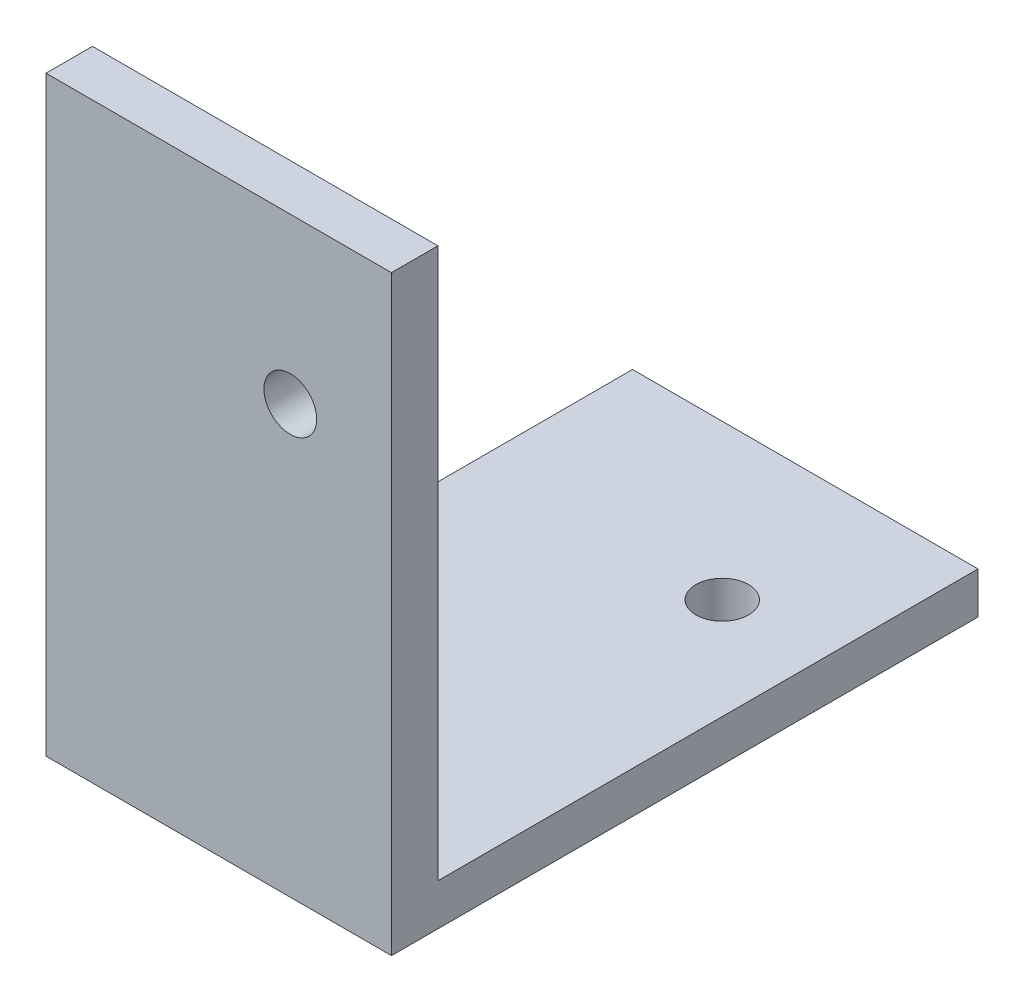
ISO-10303-21;
HEADER;
FILE_DESCRIPTION(('STEP AP214'),'2;1');
FILE_NAME('part.step','',(''),(''),'','','');
FILE_SCHEMA(('AUTOMOTIVE_DESIGN { 1 0 10303 214 1 1 1 1 }'));
ENDSEC;
DATA;
#1=APPLICATION_CONTEXT('core data for automotive mechanical design processes');
#2=APPLICATION_PROTOCOL_DEFINITION('international standard','automotive_design',2000,#1);
#3=PRODUCT_CONTEXT('',#1,'mechanical');
#4=PRODUCT('Part','Part','',(#3));
#5=PRODUCT_RELATED_PRODUCT_CATEGORY('part','',(#4));
#6=PRODUCT_DEFINITION_FORMATION('','',#4);
#7=PRODUCT_DEFINITION_CONTEXT('part definition',#1,'design');
#8=PRODUCT_DEFINITION('design','',#6,#7);
#9=PRODUCT_DEFINITION_SHAPE('','',#8);
#10=(LENGTH_UNIT() NAMED_UNIT(*) SI_UNIT(.MILLI.,.METRE.));
#11=(NAMED_UNIT(*) PLANE_ANGLE_UNIT() SI_UNIT($,.RADIAN.));
#12=(NAMED_UNIT(*) SI_UNIT($,.STERADIAN.) SOLID_ANGLE_UNIT());
#13=UNCERTAINTY_MEASURE_WITH_UNIT(LENGTH_MEASURE(1.E-05),#10,'distance_accuracy_value','');
#14=(GEOMETRIC_REPRESENTATION_CONTEXT(3) GLOBAL_UNCERTAINTY_ASSIGNED_CONTEXT((#13)) GLOBAL_UNIT_ASSIGNED_CONTEXT((#10,
#11,#12)) REPRESENTATION_CONTEXT('',''));
#15=CARTESIAN_POINT('',(0.,0.,0.));
#16=DIRECTION('',(0.,0.,1.));
#17=DIRECTION('',(1.,0.,0.));
#18=AXIS2_PLACEMENT_3D('',#15,#16,#17);
#19=CARTESIAN_POINT('',(19.142135623731,-40.,-19.142135623731));
#20=DIRECTION('',(0.,1.,0.));
#21=DIRECTION('',(0.,0.,1.));
#22=AXIS2_PLACEMENT_3D('',#19,#20,#21);
#23=CYLINDRICAL_SURFACE('',#22,1.525);
#24=CARTESIAN_POINT('',(19.142135623731,-5.58625904914895,-19.142135623731));
#25=DIRECTION('',(0.,1.,0.));
#26=DIRECTION('',(0.,0.,1.));
#27=AXIS2_PLACEMENT_3D('',#24,#25,#26);
#28=CIRCLE('',#27,1.525);
#29=CARTESIAN_POINT('',(19.142135623731,-5.58625904914894,-17.6171356237309));
#30=VERTEX_POINT('',#29);
#31=EDGE_CURVE('E147',#30,#30,#28,.F.);
#32=CARTESIAN_POINT('',(19.142135623731,-3.17499999999997,-19.142135623731));
#33=DIRECTION('',(0.,1.,0.));
#34=DIRECTION('',(0.,0.,1.));
#35=AXIS2_PLACEMENT_3D('',#32,#33,#34);
#36=CIRCLE('',#35,1.525);
#37=CARTESIAN_POINT('',(19.142135623731,-3.17499999999997,-17.6171356237309));
#38=VERTEX_POINT('',#37);
#39=EDGE_CURVE('E132',#38,#38,#36,.F.);
#40=CARTESIAN_POINT('',(19.142135623731,-5.58625904914894,-17.6171356237309));
#41=CARTESIAN_POINT('',(19.142135623731,-5.56114176738698,-17.6171356237309));
#42=CARTESIAN_POINT('',(19.142135623731,-5.53602448562501,-17.6171356237309));
#43=CARTESIAN_POINT('',(19.142135623731,-5.48578992210107,-17.6171356237309));
#44=CARTESIAN_POINT('',(19.142135623731,-5.4606726403391,-17.6171356237309));
#45=CARTESIAN_POINT('',(19.142135623731,-5.41043807681517,-17.6171356237309));
#46=CARTESIAN_POINT('',(19.142135623731,-5.3853207950532,-17.6171356237309));
#47=CARTESIAN_POINT('',(19.142135623731,-5.33508623152926,-17.6171356237309));
#48=CARTESIAN_POINT('',(19.142135623731,-5.30996894976729,-17.6171356237309));
#49=CARTESIAN_POINT('',(19.142135623731,-5.25973438624336,-17.6171356237309));
#50=CARTESIAN_POINT('',(19.142135623731,-5.23461710448139,-17.6171356237309));
#51=CARTESIAN_POINT('',(19.142135623731,-5.18438254095745,-17.6171356237309));
#52=CARTESIAN_POINT('',(19.142135623731,-5.15926525919548,-17.6171356237309));
#53=CARTESIAN_POINT('',(19.142135623731,-5.10903069567155,-17.6171356237309));
#54=CARTESIAN_POINT('',(19.142135623731,-5.08391341390958,-17.6171356237309));
#55=CARTESIAN_POINT('',(19.142135623731,-5.03367885038564,-17.6171356237309));
#56=CARTESIAN_POINT('',(19.142135623731,-5.00856156862367,-17.6171356237309));
#57=CARTESIAN_POINT('',(19.142135623731,-4.95832700509973,-17.6171356237309));
#58=CARTESIAN_POINT('',(19.142135623731,-4.93320972333776,-17.6171356237309));
#59=CARTESIAN_POINT('',(19.142135623731,-4.88297515981382,-17.6171356237309));
#60=CARTESIAN_POINT('',(19.142135623731,-4.85785787805186,-17.6171356237309));
#61=CARTESIAN_POINT('',(19.142135623731,-4.80762331452792,-17.6171356237309));
#62=CARTESIAN_POINT('',(19.142135623731,-4.78250603276595,-17.6171356237309));
#63=CARTESIAN_POINT('',(19.142135623731,-4.73227146924201,-17.6171356237309));
#64=CARTESIAN_POINT('',(19.142135623731,-4.70715418748005,-17.6171356237309));
#65=CARTESIAN_POINT('',(19.142135623731,-4.65691962395611,-17.6171356237309));
#66=CARTESIAN_POINT('',(19.142135623731,-4.63180234219414,-17.6171356237309));
#67=CARTESIAN_POINT('',(19.142135623731,-4.5815677786702,-17.6171356237309));
#68=CARTESIAN_POINT('',(19.142135623731,-4.55645049690824,-17.6171356237309));
#69=CARTESIAN_POINT('',(19.142135623731,-4.5062159333843,-17.6171356237309));
#70=CARTESIAN_POINT('',(19.142135623731,-4.48109865162233,-17.6171356237309));
#71=CARTESIAN_POINT('',(19.142135623731,-4.43086408809839,-17.6171356237309));
#72=CARTESIAN_POINT('',(19.142135623731,-4.40574680633643,-17.6171356237309));
#73=CARTESIAN_POINT('',(19.142135623731,-4.35551224281249,-17.6171356237309));
#74=CARTESIAN_POINT('',(19.142135623731,-4.33039496105052,-17.6171356237309));
#75=CARTESIAN_POINT('',(19.142135623731,-4.28016039752658,-17.6171356237309));
#76=CARTESIAN_POINT('',(19.142135623731,-4.25504311576462,-17.6171356237309));
#77=CARTESIAN_POINT('',(19.142135623731,-4.20480855224068,-17.6171356237309));
#78=CARTESIAN_POINT('',(19.142135623731,-4.17969127047871,-17.6171356237309));
#79=CARTESIAN_POINT('',(19.142135623731,-4.12945670695477,-17.6171356237309));
#80=CARTESIAN_POINT('',(19.142135623731,-4.10433942519281,-17.6171356237309));
#81=CARTESIAN_POINT('',(19.142135623731,-4.05410486166887,-17.6171356237309));
#82=CARTESIAN_POINT('',(19.142135623731,-4.0289875799069,-17.6171356237309));
#83=CARTESIAN_POINT('',(19.142135623731,-3.97875301638296,-17.6171356237309));
#84=CARTESIAN_POINT('',(19.142135623731,-3.953635734621,-17.6171356237309));
#85=CARTESIAN_POINT('',(19.142135623731,-3.90340117109706,-17.6171356237309));
#86=CARTESIAN_POINT('',(19.142135623731,-3.87828388933509,-17.6171356237309));
#87=CARTESIAN_POINT('',(19.142135623731,-3.82804932581115,-17.6171356237309));
#88=CARTESIAN_POINT('',(19.142135623731,-3.80293204404918,-17.6171356237309));
#89=CARTESIAN_POINT('',(19.142135623731,-3.75269748052524,-17.6171356237309));
#90=CARTESIAN_POINT('',(19.142135623731,-3.72758019876327,-17.6171356237309));
#91=CARTESIAN_POINT('',(19.142135623731,-3.67734563523934,-17.6171356237309));
#92=CARTESIAN_POINT('',(19.142135623731,-3.65222835347737,-17.6171356237309));
#93=CARTESIAN_POINT('',(19.142135623731,-3.60199378995343,-17.6171356237309));
#94=CARTESIAN_POINT('',(19.142135623731,-3.57687650819146,-17.6171356237309));
#95=CARTESIAN_POINT('',(19.142135623731,-3.52664194466753,-17.6171356237309));
#96=CARTESIAN_POINT('',(19.142135623731,-3.50152466290556,-17.6171356237309));
#97=CARTESIAN_POINT('',(19.142135623731,-3.45129009938162,-17.6171356237309));
#98=CARTESIAN_POINT('',(19.142135623731,-3.42617281761965,-17.6171356237309));
#99=CARTESIAN_POINT('',(19.142135623731,-3.37593825409572,-17.6171356237309));
#100=CARTESIAN_POINT('',(19.142135623731,-3.35082097233375,-17.6171356237309));
#101=CARTESIAN_POINT('',(19.142135623731,-3.30058640880981,-17.6171356237309));
#102=CARTESIAN_POINT('',(19.142135623731,-3.27546912704784,-17.6171356237309));
#103=CARTESIAN_POINT('',(19.142135623731,-3.22523456352391,-17.6171356237309));
#104=CARTESIAN_POINT('',(19.142135623731,-3.20011728176194,-17.6171356237309));
#105=CARTESIAN_POINT('',(19.142135623731,-3.17499999999997,-17.6171356237309));
#106=B_SPLINE_CURVE_WITH_KNOTS('',3,(#40,#41,#42,#43,#44,#45,#46,#47,#48,#49,#50,#51,#52,#53,
#54,#55,#56,#57,#58,#59,#60,#61,#62,#63,#64,#65,#66,#67,#68,#69,#70,#71,#72,#73,#74,#75,#76,#77,
#78,#79,#80,#81,#82,#83,#84,#85,#86,#87,#88,#89,#90,#91,#92,#93,#94,#95,#96,#97,#98,#99,#100,
#101,#102,#103,#104,#105),.UNSPECIFIED.,.F.,.F.,(4,2,2,2,2,2,2,2,2,2,2,2,2,2,2,2,2,2,2,2,2,2,2,
2,2,2,2,2,2,2,2,2,4),(0.,0.0753518452859051,0.15070369057181,0.226055535857715,0.30140738114362,
0.376759226429525,0.45211107171543,0.527462917001335,0.60281476228724,0.678166607573152,
0.753518452859057,0.828870298144962,0.904222143430867,0.979573988716773,1.05492583400268,
1.13027767928858,1.20562952457449,1.28098136986039,1.3563332151463,1.4316850604322,
1.50703690571811,1.58238875100401,1.65774059628992,1.73309244157582,1.80844428686173,
1.88379613214764,1.95914797743355,2.03449982271945,2.10985166800536,2.18520351329126,
2.26055535857717,2.33590720386307,2.41125904914898),.UNSPECIFIED.);
#107=EDGE_CURVE('BSEAM59',#30,#38,#106,.T.);
#108=ORIENTED_EDGE('',*,*,#31,.T.);
#109=ORIENTED_EDGE('',*,*,#39,.F.);
#110=ORIENTED_EDGE('',*,*,#107,.T.);
#111=ORIENTED_EDGE('',*,*,#107,.F.);
#112=EDGE_LOOP('',(#108,#110,#109,#111));
#113=FACE_BOUND('',#112,.T.);
#114=ADVANCED_FACE('F59',(#113),#23,.F.);
#115=CARTESIAN_POINT('',(19.142135623731,19.142135623731,40.));
#116=DIRECTION('',(0.,0.,-1.));
#117=DIRECTION('',(-1.,0.,0.));
#118=AXIS2_PLACEMENT_3D('',#115,#116,#117);
#119=CYLINDRICAL_SURFACE('',#118,1.525);
#120=CARTESIAN_POINT('',(19.142135623731,19.142135623731,5.86559661959344));
#121=DIRECTION('',(0.,0.,1.));
#122=DIRECTION('',(1.,0.,0.));
#123=AXIS2_PLACEMENT_3D('',#120,#121,#122);
#124=CIRCLE('',#123,1.525);
#125=CARTESIAN_POINT('',(17.617135623731,19.142135623731,5.86559661959343));
#126=VERTEX_POINT('',#125);
#127=EDGE_CURVE('E62',#126,#126,#124,.F.);
#128=CARTESIAN_POINT('',(19.142135623731,19.142135623731,3.175));
#129=DIRECTION('',(0.,0.,-1.));
#130=DIRECTION('',(-1.,0.,0.));
#131=AXIS2_PLACEMENT_3D('',#128,#129,#130);
#132=CIRCLE('',#131,1.525);
#133=CARTESIAN_POINT('',(17.617135623731,19.142135623731,3.175));
#134=VERTEX_POINT('',#133);
#135=EDGE_CURVE('E129',#134,#134,#132,.F.);
#136=CARTESIAN_POINT('',(17.617135623731,19.142135623731,5.86559661959343));
#137=CARTESIAN_POINT('',(17.617135623731,19.142135623731,5.83756957147267));
#138=CARTESIAN_POINT('',(17.617135623731,19.142135623731,5.8095425233519));
#139=CARTESIAN_POINT('',(17.617135623731,19.142135623731,5.75348842711037));
#140=CARTESIAN_POINT('',(17.617135623731,19.142135623731,5.72546137898961));
#141=CARTESIAN_POINT('',(17.617135623731,19.142135623731,5.66940728274808));
#142=CARTESIAN_POINT('',(17.617135623731,19.142135623731,5.64138023462731));
#143=CARTESIAN_POINT('',(17.617135623731,19.142135623731,5.58532613838578));
#144=CARTESIAN_POINT('',(17.617135623731,19.142135623731,5.55729909026502));
#145=CARTESIAN_POINT('',(17.617135623731,19.142135623731,5.50124499402349));
#146=CARTESIAN_POINT('',(17.617135623731,19.142135623731,5.47321794590272));
#147=CARTESIAN_POINT('',(17.617135623731,19.142135623731,5.41716384966119));
#148=CARTESIAN_POINT('',(17.617135623731,19.142135623731,5.38913680154043));
#149=CARTESIAN_POINT('',(17.617135623731,19.142135623731,5.3330827052989));
#150=CARTESIAN_POINT('',(17.617135623731,19.142135623731,5.30505565717813));
#151=CARTESIAN_POINT('',(17.617135623731,19.142135623731,5.24900156093661));
#152=CARTESIAN_POINT('',(17.617135623731,19.142135623731,5.22097451281584));
#153=CARTESIAN_POINT('',(17.617135623731,19.142135623731,5.16492041657431));
#154=CARTESIAN_POINT('',(17.617135623731,19.142135623731,5.13689336845354));
#155=CARTESIAN_POINT('',(17.617135623731,19.142135623731,5.08083927221201));
#156=CARTESIAN_POINT('',(17.617135623731,19.142135623731,5.05281222409125));
#157=CARTESIAN_POINT('',(17.617135623731,19.142135623731,4.99675812784972));
#158=CARTESIAN_POINT('',(17.617135623731,19.142135623731,4.96873107972896));
#159=CARTESIAN_POINT('',(17.617135623731,19.142135623731,4.91267698348743));
#160=CARTESIAN_POINT('',(17.617135623731,19.142135623731,4.88464993536666));
#161=CARTESIAN_POINT('',(17.617135623731,19.142135623731,4.82859583912513));
#162=CARTESIAN_POINT('',(17.617135623731,19.142135623731,4.80056879100436));
#163=CARTESIAN_POINT('',(17.617135623731,19.142135623731,4.74451469476284));
#164=CARTESIAN_POINT('',(17.617135623731,19.142135623731,4.71648764664207));
#165=CARTESIAN_POINT('',(17.617135623731,19.142135623731,4.66043355040054));
#166=CARTESIAN_POINT('',(17.617135623731,19.142135623731,4.63240650227977));
#167=CARTESIAN_POINT('',(17.617135623731,19.142135623731,4.57635240603824));
#168=CARTESIAN_POINT('',(17.617135623731,19.142135623731,4.54832535791748));
#169=CARTESIAN_POINT('',(17.617135623731,19.142135623731,4.49227126167595));
#170=CARTESIAN_POINT('',(17.617135623731,19.142135623731,4.46424421355519));
#171=CARTESIAN_POINT('',(17.617135623731,19.142135623731,4.40819011731366));
#172=CARTESIAN_POINT('',(17.617135623731,19.142135623731,4.38016306919289));
#173=CARTESIAN_POINT('',(17.617135623731,19.142135623731,4.32410897295136));
#174=CARTESIAN_POINT('',(17.617135623731,19.142135623731,4.29608192483059));
#175=CARTESIAN_POINT('',(17.617135623731,19.142135623731,4.24002782858907));
#176=CARTESIAN_POINT('',(17.617135623731,19.142135623731,4.2120007804683));
#177=CARTESIAN_POINT('',(17.617135623731,19.142135623731,4.15594668422677));
#178=CARTESIAN_POINT('',(17.617135623731,19.142135623731,4.127919636106));
#179=CARTESIAN_POINT('',(17.617135623731,19.142135623731,4.07186553986447));
#180=CARTESIAN_POINT('',(17.617135623731,19.142135623731,4.04383849174371));
#181=CARTESIAN_POINT('',(17.617135623731,19.142135623731,3.98778439550218));
#182=CARTESIAN_POINT('',(17.617135623731,19.142135623731,3.95975734738142));
#183=CARTESIAN_POINT('',(17.617135623731,19.142135623731,3.90370325113989));
#184=CARTESIAN_POINT('',(17.617135623731,19.142135623731,3.87567620301912));
#185=CARTESIAN_POINT('',(17.617135623731,19.142135623731,3.81962210677759));
#186=CARTESIAN_POINT('',(17.617135623731,19.142135623731,3.79159505865682));
#187=CARTESIAN_POINT('',(17.617135623731,19.142135623731,3.7355409624153));
#188=CARTESIAN_POINT('',(17.617135623731,19.142135623731,3.70751391429453));
#189=CARTESIAN_POINT('',(17.617135623731,19.142135623731,3.651459818053));
#190=CARTESIAN_POINT('',(17.617135623731,19.142135623731,3.62343276993224));
#191=CARTESIAN_POINT('',(17.617135623731,19.142135623731,3.56737867369071));
#192=CARTESIAN_POINT('',(17.617135623731,19.142135623731,3.53935162556994));
#193=CARTESIAN_POINT('',(17.617135623731,19.142135623731,3.48329752932841));
#194=CARTESIAN_POINT('',(17.617135623731,19.142135623731,3.45527048120765));
#195=CARTESIAN_POINT('',(17.617135623731,19.142135623731,3.39921638496612));
#196=CARTESIAN_POINT('',(17.617135623731,19.142135623731,3.37118933684535));
#197=CARTESIAN_POINT('',(17.617135623731,19.142135623731,3.31513524060382));
#198=CARTESIAN_POINT('',(17.617135623731,19.142135623731,3.28710819248306));
#199=CARTESIAN_POINT('',(17.617135623731,19.142135623731,3.23105409624153));
#200=CARTESIAN_POINT('',(17.617135623731,19.142135623731,3.20302704812076));
#201=CARTESIAN_POINT('',(17.617135623731,19.142135623731,3.175));
#202=B_SPLINE_CURVE_WITH_KNOTS('',3,(#136,#137,#138,#139,#140,#141,#142,#143,#144,#145,#146,
#147,#148,#149,#150,#151,#152,#153,#154,#155,#156,#157,#158,#159,#160,#161,#162,#163,#164,#165,
#166,#167,#168,#169,#170,#171,#172,#173,#174,#175,#176,#177,#178,#179,#180,#181,#182,#183,#184,
#185,#186,#187,#188,#189,#190,#191,#192,#193,#194,#195,#196,#197,#198,#199,#200,#201),
.UNSPECIFIED.,.F.,.F.,(4,2,2,2,2,2,2,2,2,2,2,2,2,2,2,2,2,2,2,2,2,2,2,2,2,2,2,2,2,2,2,2,4),(0.,
0.0840811443622927,0.168162288724592,0.252243433086885,0.336324577449178,0.420405721811477,
0.50448686617377,0.588568010536063,0.672649154898355,0.756730299260655,0.840811443622948,
0.92489258798524,1.00897373234754,1.09305487670983,1.17713602107213,1.26121716543443,
1.34529830979672,1.42937945415901,1.51346059852131,1.5975417428836,1.6816228872459,
1.7657040316082,1.84978517597049,1.93386632033278,2.01794746469508,2.10202860905737,
2.18610975341967,2.27019089778196,2.35427204214426,2.43835318650655,2.52243433086884,
2.60651547523114,2.69059661959344),.UNSPECIFIED.);
#203=EDGE_CURVE('BSEAM175',#126,#134,#202,.T.);
#204=ORIENTED_EDGE('',*,*,#127,.F.);
#205=ORIENTED_EDGE('',*,*,#135,.F.);
#206=ORIENTED_EDGE('',*,*,#203,.T.);
#207=ORIENTED_EDGE('',*,*,#203,.F.);
#208=EDGE_LOOP('',(#204,#206,#205,#207));
#209=FACE_BOUND('',#208,.T.);
#210=ADVANCED_FACE('F175',(#209),#119,.F.);
#211=CARTESIAN_POINT('',(25.,-17.58,0.));
#212=DIRECTION('',(1.,0.,0.));
#213=DIRECTION('',(0.,0.,-1.));
#214=AXIS2_PLACEMENT_3D('',#211,#212,#213);
#215=PLANE('',#214);
#216=DIRECTION('',(0.,0.,1.));
#217=VECTOR('',#216,1.);
#218=CARTESIAN_POINT('',(25.,-3.175,0.));
#219=LINE('',#218,#217);
#220=CARTESIAN_POINT('',(25.,-3.175,-28.089478600949));
#221=VERTEX_POINT('',#220);
#222=CARTESIAN_POINT('',(25.,-3.175,3.175));
#223=VERTEX_POINT('',#222);
#224=EDGE_CURVE('E146',#221,#223,#219,.T.);
#225=ORIENTED_EDGE('',*,*,#224,.T.);
#226=DIRECTION('',(0.,-1.,0.));
#227=VECTOR('',#226,1.);
#228=CARTESIAN_POINT('',(25.,0.,3.175));
#229=LINE('',#228,#227);
#230=CARTESIAN_POINT('',(25.,28.6575498042213,3.175));
#231=VERTEX_POINT('',#230);
#232=EDGE_CURVE('E128',#231,#223,#229,.T.);
#233=ORIENTED_EDGE('',*,*,#232,.F.);
#234=DIRECTION('',(0.,0.,1.));
#235=VECTOR('',#234,1.);
#236=CARTESIAN_POINT('',(25.,28.6575498042213,0.));
#237=LINE('',#236,#235);
#238=CARTESIAN_POINT('',(25.,28.6575498042213,5.86559661959344));
#239=VERTEX_POINT('',#238);
#240=EDGE_CURVE('E150',#231,#239,#237,.T.);
#241=ORIENTED_EDGE('',*,*,#240,.T.);
#242=DIRECTION('',(0.,-1.,0.));
#243=VECTOR('',#242,1.);
#244=CARTESIAN_POINT('',(25.,0.,5.86559661959344));
#245=LINE('',#244,#243);
#246=CARTESIAN_POINT('',(25.,-5.58625904914895,5.86559661959344));
#247=VERTEX_POINT('',#246);
#248=EDGE_CURVE('E153',#239,#247,#245,.T.);
#249=ORIENTED_EDGE('',*,*,#248,.T.);
#250=DIRECTION('',(0.,0.,1.));
#251=VECTOR('',#250,1.);
#252=CARTESIAN_POINT('',(25.,-5.58625904914895,0.));
#253=LINE('',#252,#251);
#254=CARTESIAN_POINT('',(25.,-5.58625904914895,-28.089478600949));
#255=VERTEX_POINT('',#254);
#256=EDGE_CURVE('E156',#255,#247,#253,.T.);
#257=ORIENTED_EDGE('',*,*,#256,.F.);
#258=DIRECTION('',(0.,1.,0.));
#259=VECTOR('',#258,1.);
#260=CARTESIAN_POINT('',(25.,0.,-28.089478600949));
#261=LINE('',#260,#259);
#262=EDGE_CURVE('E143',#255,#221,#261,.T.);
#263=ORIENTED_EDGE('',*,*,#262,.T.);
#264=EDGE_LOOP('',(#225,#233,#241,#249,#257,#263));
#265=FACE_BOUND('',#264,.T.);
#266=ADVANCED_FACE('F178',(#265),#215,.T.);
#267=CARTESIAN_POINT('',(5.00000000000001,27.42,8.17500000000001));
#268=DIRECTION('',(1.,0.,0.));
#269=DIRECTION('',(0.,0.,-1.));
#270=AXIS2_PLACEMENT_3D('',#267,#268,#269);
#271=PLANE('',#270);
#272=DIRECTION('',(0.,1.,0.));
#273=VECTOR('',#272,1.);
#274=CARTESIAN_POINT('',(5.,0.,3.175));
#275=LINE('',#274,#273);
#276=CARTESIAN_POINT('',(5.00000000000001,-3.175,3.175));
#277=VERTEX_POINT('',#276);
#278=CARTESIAN_POINT('',(5.,28.6575498042213,3.175));
#279=VERTEX_POINT('',#278);
#280=EDGE_CURVE('E75',#277,#279,#275,.T.);
#281=ORIENTED_EDGE('',*,*,#280,.F.);
#282=DIRECTION('',(0.,0.,-1.));
#283=VECTOR('',#282,1.);
#284=CARTESIAN_POINT('',(5.,-3.175,0.));
#285=LINE('',#284,#283);
#286=CARTESIAN_POINT('',(5.,-3.175,-28.089478600949));
#287=VERTEX_POINT('',#286);
#288=EDGE_CURVE('E12',#277,#287,#285,.T.);
#289=ORIENTED_EDGE('',*,*,#288,.T.);
#290=DIRECTION('',(0.,-1.,0.));
#291=VECTOR('',#290,1.);
#292=CARTESIAN_POINT('',(5.,0.,-28.089478600949));
#293=LINE('',#292,#291);
#294=CARTESIAN_POINT('',(5.,-5.58625904914895,-28.089478600949));
#295=VERTEX_POINT('',#294);
#296=EDGE_CURVE('E67',#287,#295,#293,.T.);
#297=ORIENTED_EDGE('',*,*,#296,.T.);
#298=DIRECTION('',(0.,0.,-1.));
#299=VECTOR('',#298,1.);
#300=CARTESIAN_POINT('',(5.,-5.58625904914895,0.));
#301=LINE('',#300,#299);
#302=CARTESIAN_POINT('',(5.,-5.58625904914895,5.86559661959344));
#303=VERTEX_POINT('',#302);
#304=EDGE_CURVE('E139',#303,#295,#301,.T.);
#305=ORIENTED_EDGE('',*,*,#304,.F.);
#306=DIRECTION('',(0.,1.,0.));
#307=VECTOR('',#306,1.);
#308=CARTESIAN_POINT('',(5.,0.,5.86559661959344));
#309=LINE('',#308,#307);
#310=CARTESIAN_POINT('',(5.,28.6575498042213,5.86559661959344));
#311=VERTEX_POINT('',#310);
#312=EDGE_CURVE('E82',#303,#311,#309,.T.);
#313=ORIENTED_EDGE('',*,*,#312,.T.);
#314=DIRECTION('',(0.,0.,-1.));
#315=VECTOR('',#314,1.);
#316=CARTESIAN_POINT('',(5.,28.6575498042213,0.));
#317=LINE('',#316,#315);
#318=EDGE_CURVE('E120',#311,#279,#317,.T.);
#319=ORIENTED_EDGE('',*,*,#318,.T.);
#320=EDGE_LOOP('',(#281,#289,#297,#305,#313,#319));
#321=FACE_BOUND('',#320,.T.);
#322=ADVANCED_FACE('F119',(#321),#271,.F.);
#323=CARTESIAN_POINT('',(-43.2243255838675,-3.175,0.));
#324=DIRECTION('',(0.,1.,0.));
#325=DIRECTION('',(0.,0.,1.));
#326=AXIS2_PLACEMENT_3D('',#323,#324,#325);
#327=PLANE('',#326);
#328=ORIENTED_EDGE('',*,*,#288,.F.);
#329=DIRECTION('',(-1.,0.,0.));
#330=VECTOR('',#329,1.);
#331=CARTESIAN_POINT('',(34.175,-3.175,3.175));
#332=LINE('',#331,#330);
#333=EDGE_CURVE('E116',#223,#277,#332,.T.);
#334=ORIENTED_EDGE('',*,*,#333,.F.);
#335=ORIENTED_EDGE('',*,*,#224,.F.);
#336=DIRECTION('',(1.,0.,0.));
#337=VECTOR('',#336,1.);
#338=CARTESIAN_POINT('',(-43.2243255838675,-3.175,-28.089478600949));
#339=LINE('',#338,#337);
#340=EDGE_CURVE('E117',#287,#221,#339,.T.);
#341=ORIENTED_EDGE('',*,*,#340,.F.);
#342=EDGE_LOOP('',(#328,#334,#335,#341));
#343=FACE_BOUND('',#342,.T.);
#344=ORIENTED_EDGE('',*,*,#39,.T.);
#345=EDGE_LOOP('',(#344));
#346=FACE_BOUND('',#345,.T.);
#347=ADVANCED_FACE('F113',(#343,#346),#327,.T.);
#348=CARTESIAN_POINT('',(-43.2243255838675,0.,-28.089478600949));
#349=DIRECTION('',(0.,0.,-1.));
#350=DIRECTION('',(-1.,0.,0.));
#351=AXIS2_PLACEMENT_3D('',#348,#349,#350);
#352=PLANE('',#351);
#353=ORIENTED_EDGE('',*,*,#296,.F.);
#354=ORIENTED_EDGE('',*,*,#340,.T.);
#355=ORIENTED_EDGE('',*,*,#262,.F.);
#356=DIRECTION('',(1.,0.,0.));
#357=VECTOR('',#356,1.);
#358=CARTESIAN_POINT('',(-43.2243255838675,-5.58625904914895,-28.089478600949));
#359=LINE('',#358,#357);
#360=EDGE_CURVE('E122',#295,#255,#359,.T.);
#361=ORIENTED_EDGE('',*,*,#360,.F.);
#362=EDGE_LOOP('',(#353,#354,#355,#361));
#363=FACE_BOUND('',#362,.T.);
#364=ADVANCED_FACE('F195',(#363),#352,.T.);
#365=CARTESIAN_POINT('',(-43.2243255838675,-5.58625904914895,0.));
#366=DIRECTION('',(0.,1.,0.));
#367=DIRECTION('',(0.,0.,1.));
#368=AXIS2_PLACEMENT_3D('',#365,#366,#367);
#369=PLANE('',#368);
#370=ORIENTED_EDGE('',*,*,#31,.F.);
#371=EDGE_LOOP('',(#370));
#372=FACE_BOUND('',#371,.T.);
#373=DIRECTION('',(1.,0.,0.));
#374=VECTOR('',#373,1.);
#375=CARTESIAN_POINT('',(-43.2243255838675,-5.58625904914895,5.86559661959344));
#376=LINE('',#375,#374);
#377=EDGE_CURVE('E160',#303,#247,#376,.T.);
#378=ORIENTED_EDGE('',*,*,#377,.F.);
#379=ORIENTED_EDGE('',*,*,#304,.T.);
#380=ORIENTED_EDGE('',*,*,#360,.T.);
#381=ORIENTED_EDGE('',*,*,#256,.T.);
#382=EDGE_LOOP('',(#378,#379,#380,#381));
#383=FACE_BOUND('',#382,.T.);
#384=ADVANCED_FACE('F200',(#372,#383),#369,.F.);
#385=CARTESIAN_POINT('',(-43.2243255838675,0.,5.86559661959344));
#386=DIRECTION('',(0.,0.,1.));
#387=DIRECTION('',(1.,0.,0.));
#388=AXIS2_PLACEMENT_3D('',#385,#386,#387);
#389=PLANE('',#388);
#390=ORIENTED_EDGE('',*,*,#127,.T.);
#391=EDGE_LOOP('',(#390));
#392=FACE_BOUND('',#391,.T.);
#393=ORIENTED_EDGE('',*,*,#312,.F.);
#394=ORIENTED_EDGE('',*,*,#377,.T.);
#395=ORIENTED_EDGE('',*,*,#248,.F.);
#396=DIRECTION('',(1.,0.,0.));
#397=VECTOR('',#396,1.);
#398=CARTESIAN_POINT('',(-43.2243255838675,28.6575498042213,5.86559661959344));
#399=LINE('',#398,#397);
#400=EDGE_CURVE('E162',#311,#239,#399,.T.);
#401=ORIENTED_EDGE('',*,*,#400,.F.);
#402=EDGE_LOOP('',(#393,#394,#395,#401));
#403=FACE_BOUND('',#402,.T.);
#404=ADVANCED_FACE('F172',(#392,#403),#389,.T.);
#405=CARTESIAN_POINT('',(-43.2243255838675,28.6575498042213,0.));
#406=DIRECTION('',(0.,1.,0.));
#407=DIRECTION('',(0.,0.,1.));
#408=AXIS2_PLACEMENT_3D('',#405,#406,#407);
#409=PLANE('',#408);
#410=ORIENTED_EDGE('',*,*,#318,.F.);
#411=ORIENTED_EDGE('',*,*,#400,.T.);
#412=ORIENTED_EDGE('',*,*,#240,.F.);
#413=DIRECTION('',(1.,0.,0.));
#414=VECTOR('',#413,1.);
#415=CARTESIAN_POINT('',(-43.2243255838675,28.6575498042213,3.175));
#416=LINE('',#415,#414);
#417=EDGE_CURVE('E164',#279,#231,#416,.T.);
#418=ORIENTED_EDGE('',*,*,#417,.F.);
#419=EDGE_LOOP('',(#410,#411,#412,#418));
#420=FACE_BOUND('',#419,.T.);
#421=ADVANCED_FACE('F181',(#420),#409,.T.);
#422=CARTESIAN_POINT('',(-43.2243255838675,0.,3.175));
#423=DIRECTION('',(0.,0.,1.));
#424=DIRECTION('',(1.,0.,0.));
#425=AXIS2_PLACEMENT_3D('',#422,#423,#424);
#426=PLANE('',#425);
#427=ORIENTED_EDGE('',*,*,#232,.T.);
#428=ORIENTED_EDGE('',*,*,#333,.T.);
#429=ORIENTED_EDGE('',*,*,#280,.T.);
#430=ORIENTED_EDGE('',*,*,#417,.T.);
#431=EDGE_LOOP('',(#427,#428,#429,#430));
#432=FACE_BOUND('',#431,.T.);
#433=ORIENTED_EDGE('',*,*,#135,.T.);
#434=EDGE_LOOP('',(#433));
#435=FACE_BOUND('',#434,.T.);
#436=ADVANCED_FACE('F125',(#432,#435),#426,.F.);
#437=CLOSED_SHELL('',(#114,#210,#266,#322,#347,#364,#384,#404,#421,#436));
#438=MANIFOLD_SOLID_BREP('B2',#437);
#439=ADVANCED_BREP_SHAPE_REPRESENTATION('',(#18,#438),#14);
#440=SHAPE_DEFINITION_REPRESENTATION(#9,#439);
ENDSEC;
END-ISO-10303-21;
